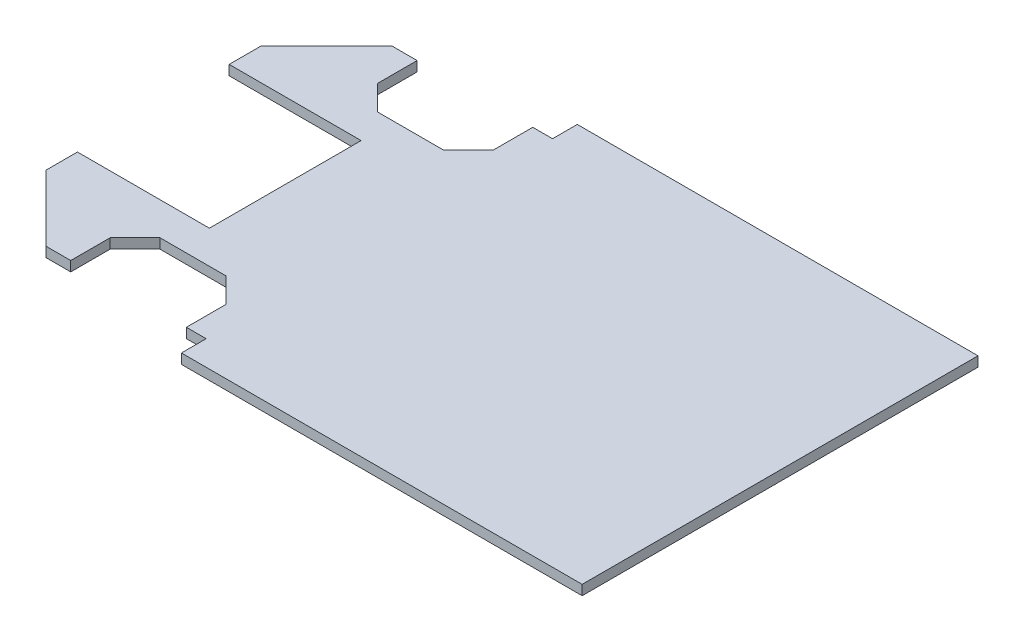
ISO-10303-21;
HEADER;
FILE_DESCRIPTION(('STEP AP214'),'2;1');
FILE_NAME('part.step','',(''),(''),'','','');
FILE_SCHEMA(('AUTOMOTIVE_DESIGN { 1 0 10303 214 1 1 1 1 }'));
ENDSEC;
DATA;
#1=APPLICATION_CONTEXT('core data for automotive mechanical design processes');
#2=APPLICATION_PROTOCOL_DEFINITION('international standard','automotive_design',2000,#1);
#3=PRODUCT_CONTEXT('',#1,'mechanical');
#4=PRODUCT('Part','Part','',(#3));
#5=PRODUCT_RELATED_PRODUCT_CATEGORY('part','',(#4));
#6=PRODUCT_DEFINITION_FORMATION('','',#4);
#7=PRODUCT_DEFINITION_CONTEXT('part definition',#1,'design');
#8=PRODUCT_DEFINITION('design','',#6,#7);
#9=PRODUCT_DEFINITION_SHAPE('','',#8);
#10=(LENGTH_UNIT() NAMED_UNIT(*) SI_UNIT(.MILLI.,.METRE.));
#11=(NAMED_UNIT(*) PLANE_ANGLE_UNIT() SI_UNIT($,.RADIAN.));
#12=(NAMED_UNIT(*) SI_UNIT($,.STERADIAN.) SOLID_ANGLE_UNIT());
#13=UNCERTAINTY_MEASURE_WITH_UNIT(LENGTH_MEASURE(1.E-05),#10,'distance_accuracy_value','');
#14=(GEOMETRIC_REPRESENTATION_CONTEXT(3) GLOBAL_UNCERTAINTY_ASSIGNED_CONTEXT((#13)) GLOBAL_UNIT_ASSIGNED_CONTEXT((#10,
#11,#12)) REPRESENTATION_CONTEXT('',''));
#15=CARTESIAN_POINT('',(0.,0.,0.));
#16=DIRECTION('',(0.,0.,1.));
#17=DIRECTION('',(1.,0.,0.));
#18=AXIS2_PLACEMENT_3D('',#15,#16,#17);
#19=CARTESIAN_POINT('',(-16.2633155669063,3.,-16.2633155669061));
#20=DIRECTION('',(-0.707106781186551,0.,-0.707106781186544));
#21=DIRECTION('',(-0.707106781186544,0.,0.707106781186551));
#22=AXIS2_PLACEMENT_3D('',#19,#20,#21);
#23=PLANE('',#22);
#24=DIRECTION('',(0.707106781186544,0.,-0.707106781186551));
#25=VECTOR('',#24,1.);
#26=CARTESIAN_POINT('',(-16.2633155669063,0.,-16.2633155669061));
#27=LINE('',#26,#25);
#28=CARTESIAN_POINT('',(0.,0.,-32.5266311338125));
#29=VERTEX_POINT('',#28);
#30=CARTESIAN_POINT('',(19.9733688661873,0.,-52.5));
#31=VERTEX_POINT('',#30);
#32=EDGE_CURVE('E238',#29,#31,#27,.T.);
#33=ORIENTED_EDGE('',*,*,#32,.F.);
#34=DIRECTION('',(0.,-1.,0.));
#35=VECTOR('',#34,1.);
#36=CARTESIAN_POINT('',(0.,3.,-32.5266311338125));
#37=LINE('',#36,#35);
#38=CARTESIAN_POINT('',(0.,3.,-32.5266311338125));
#39=VERTEX_POINT('',#38);
#40=EDGE_CURVE('E11',#39,#29,#37,.T.);
#41=ORIENTED_EDGE('',*,*,#40,.F.);
#42=DIRECTION('',(0.707106781186544,0.,-0.707106781186551));
#43=VECTOR('',#42,1.);
#44=CARTESIAN_POINT('',(-16.2633155669063,3.,-16.2633155669061));
#45=LINE('',#44,#43);
#46=CARTESIAN_POINT('',(19.9733688661873,3.,-52.5));
#47=VERTEX_POINT('',#46);
#48=EDGE_CURVE('E302',#39,#47,#45,.T.);
#49=ORIENTED_EDGE('',*,*,#48,.T.);
#50=DIRECTION('',(0.,-1.,0.));
#51=VECTOR('',#50,1.);
#52=CARTESIAN_POINT('',(19.9733688661873,3.,-52.5));
#53=LINE('',#52,#51);
#54=EDGE_CURVE('E53',#47,#31,#53,.T.);
#55=ORIENTED_EDGE('',*,*,#54,.T.);
#56=EDGE_LOOP('',(#33,#41,#49,#55));
#57=FACE_BOUND('',#56,.T.);
#58=ADVANCED_FACE('F37',(#57),#23,.T.);
#59=CARTESIAN_POINT('',(0.,3.,0.));
#60=DIRECTION('',(-1.,0.,0.));
#61=DIRECTION('',(0.,0.,1.));
#62=AXIS2_PLACEMENT_3D('',#59,#60,#61);
#63=PLANE('',#62);
#64=DIRECTION('',(0.,0.,-1.));
#65=VECTOR('',#64,1.);
#66=CARTESIAN_POINT('',(0.,0.,0.));
#67=LINE('',#66,#65);
#68=CARTESIAN_POINT('',(0.,0.,-23.));
#69=VERTEX_POINT('',#68);
#70=EDGE_CURVE('E240',#69,#29,#67,.T.);
#71=ORIENTED_EDGE('',*,*,#70,.F.);
#72=DIRECTION('',(0.,-1.,0.));
#73=VECTOR('',#72,1.);
#74=CARTESIAN_POINT('',(0.,3.,-23.));
#75=LINE('',#74,#73);
#76=CARTESIAN_POINT('',(0.,3.,-23.));
#77=VERTEX_POINT('',#76);
#78=EDGE_CURVE('E45',#77,#69,#75,.T.);
#79=ORIENTED_EDGE('',*,*,#78,.F.);
#80=DIRECTION('',(0.,0.,-1.));
#81=VECTOR('',#80,1.);
#82=CARTESIAN_POINT('',(0.,3.,0.));
#83=LINE('',#82,#81);
#84=EDGE_CURVE('E385',#77,#39,#83,.T.);
#85=ORIENTED_EDGE('',*,*,#84,.T.);
#86=ORIENTED_EDGE('',*,*,#40,.T.);
#87=EDGE_LOOP('',(#71,#79,#85,#86));
#88=FACE_BOUND('',#87,.T.);
#89=ADVANCED_FACE('F363',(#88),#63,.T.);
#90=CARTESIAN_POINT('',(0.,3.,-23.));
#91=DIRECTION('',(0.,0.,1.));
#92=DIRECTION('',(1.,0.,0.));
#93=AXIS2_PLACEMENT_3D('',#90,#91,#92);
#94=PLANE('',#93);
#95=DIRECTION('',(-1.,0.,0.));
#96=VECTOR('',#95,1.);
#97=CARTESIAN_POINT('',(0.,0.,-23.));
#98=LINE('',#97,#96);
#99=CARTESIAN_POINT('',(40.,0.,-23.));
#100=VERTEX_POINT('',#99);
#101=EDGE_CURVE('E243',#100,#69,#98,.T.);
#102=ORIENTED_EDGE('',*,*,#101,.F.);
#103=DIRECTION('',(0.,-1.,0.));
#104=VECTOR('',#103,1.);
#105=CARTESIAN_POINT('',(40.,3.,-23.));
#106=LINE('',#105,#104);
#107=CARTESIAN_POINT('',(40.,3.,-23.));
#108=VERTEX_POINT('',#107);
#109=EDGE_CURVE('E352',#108,#100,#106,.T.);
#110=ORIENTED_EDGE('',*,*,#109,.F.);
#111=DIRECTION('',(-1.,0.,0.));
#112=VECTOR('',#111,1.);
#113=CARTESIAN_POINT('',(0.,3.,-23.));
#114=LINE('',#113,#112);
#115=EDGE_CURVE('E359',#108,#77,#114,.T.);
#116=ORIENTED_EDGE('',*,*,#115,.T.);
#117=ORIENTED_EDGE('',*,*,#78,.T.);
#118=EDGE_LOOP('',(#102,#110,#116,#117));
#119=FACE_BOUND('',#118,.T.);
#120=ADVANCED_FACE('F357',(#119),#94,.T.);
#121=CARTESIAN_POINT('',(40.,3.,0.));
#122=DIRECTION('',(1.,0.,0.));
#123=DIRECTION('',(0.,0.,-1.));
#124=AXIS2_PLACEMENT_3D('',#121,#122,#123);
#125=PLANE('',#124);
#126=DIRECTION('',(0.,0.,1.));
#127=VECTOR('',#126,1.);
#128=CARTESIAN_POINT('',(40.,0.,0.));
#129=LINE('',#128,#127);
#130=CARTESIAN_POINT('',(40.,0.,23.));
#131=VERTEX_POINT('',#130);
#132=EDGE_CURVE('E247',#100,#131,#129,.T.);
#133=ORIENTED_EDGE('',*,*,#132,.T.);
#134=DIRECTION('',(0.,-1.,0.));
#135=VECTOR('',#134,1.);
#136=CARTESIAN_POINT('',(40.,3.,23.));
#137=LINE('',#136,#135);
#138=CARTESIAN_POINT('',(40.,3.,23.));
#139=VERTEX_POINT('',#138);
#140=EDGE_CURVE('E349',#139,#131,#137,.T.);
#141=ORIENTED_EDGE('',*,*,#140,.F.);
#142=DIRECTION('',(0.,0.,1.));
#143=VECTOR('',#142,1.);
#144=CARTESIAN_POINT('',(40.,3.,0.));
#145=LINE('',#144,#143);
#146=EDGE_CURVE('E381',#108,#139,#145,.T.);
#147=ORIENTED_EDGE('',*,*,#146,.F.);
#148=ORIENTED_EDGE('',*,*,#109,.T.);
#149=EDGE_LOOP('',(#133,#141,#147,#148));
#150=FACE_BOUND('',#149,.T.);
#151=ADVANCED_FACE('F371',(#150),#125,.F.);
#152=CARTESIAN_POINT('',(0.,3.,23.));
#153=DIRECTION('',(0.,0.,1.));
#154=DIRECTION('',(1.,0.,0.));
#155=AXIS2_PLACEMENT_3D('',#152,#153,#154);
#156=PLANE('',#155);
#157=DIRECTION('',(-1.,0.,0.));
#158=VECTOR('',#157,1.);
#159=CARTESIAN_POINT('',(0.,0.,23.));
#160=LINE('',#159,#158);
#161=CARTESIAN_POINT('',(0.,0.,23.));
#162=VERTEX_POINT('',#161);
#163=EDGE_CURVE('E249',#131,#162,#160,.T.);
#164=ORIENTED_EDGE('',*,*,#163,.T.);
#165=DIRECTION('',(0.,-1.,0.));
#166=VECTOR('',#165,1.);
#167=CARTESIAN_POINT('',(0.,3.,23.));
#168=LINE('',#167,#166);
#169=CARTESIAN_POINT('',(0.,3.,23.));
#170=VERTEX_POINT('',#169);
#171=EDGE_CURVE('E347',#170,#162,#168,.T.);
#172=ORIENTED_EDGE('',*,*,#171,.F.);
#173=DIRECTION('',(-1.,0.,0.));
#174=VECTOR('',#173,1.);
#175=CARTESIAN_POINT('',(0.,3.,23.));
#176=LINE('',#175,#174);
#177=EDGE_CURVE('E377',#139,#170,#176,.T.);
#178=ORIENTED_EDGE('',*,*,#177,.F.);
#179=ORIENTED_EDGE('',*,*,#140,.T.);
#180=EDGE_LOOP('',(#164,#172,#178,#179));
#181=FACE_BOUND('',#180,.T.);
#182=ADVANCED_FACE('F375',(#181),#156,.F.);
#183=CARTESIAN_POINT('',(0.,0.,32.5266311338125));
#184=VERTEX_POINT('',#183);
#185=EDGE_CURVE('E244',#184,#162,#67,.T.);
#186=ORIENTED_EDGE('',*,*,#185,.F.);
#187=DIRECTION('',(0.,-1.,0.));
#188=VECTOR('',#187,1.);
#189=CARTESIAN_POINT('',(0.,3.,32.5266311338125));
#190=LINE('',#189,#188);
#191=CARTESIAN_POINT('',(0.,3.,32.5266311338125));
#192=VERTEX_POINT('',#191);
#193=EDGE_CURVE('E345',#192,#184,#190,.T.);
#194=ORIENTED_EDGE('',*,*,#193,.F.);
#195=EDGE_CURVE('E380',#192,#170,#83,.T.);
#196=ORIENTED_EDGE('',*,*,#195,.T.);
#197=ORIENTED_EDGE('',*,*,#171,.T.);
#198=EDGE_LOOP('',(#186,#194,#196,#197));
#199=FACE_BOUND('',#198,.T.);
#200=ADVANCED_FACE('F445',(#199),#63,.T.);
#201=CARTESIAN_POINT('',(-16.2633155669063,3.,16.2633155669061));
#202=DIRECTION('',(0.707106781186551,0.,-0.707106781186544));
#203=DIRECTION('',(-0.707106781186544,0.,-0.707106781186551));
#204=AXIS2_PLACEMENT_3D('',#201,#202,#203);
#205=PLANE('',#204);
#206=DIRECTION('',(0.707106781186544,0.,0.707106781186551));
#207=VECTOR('',#206,1.);
#208=CARTESIAN_POINT('',(-16.2633155669063,0.,16.2633155669061));
#209=LINE('',#208,#207);
#210=CARTESIAN_POINT('',(19.9733688661873,0.,52.5));
#211=VERTEX_POINT('',#210);
#212=EDGE_CURVE('E252',#184,#211,#209,.T.);
#213=ORIENTED_EDGE('',*,*,#212,.T.);
#214=DIRECTION('',(0.,-1.,0.));
#215=VECTOR('',#214,1.);
#216=CARTESIAN_POINT('',(19.9733688661873,3.,52.5));
#217=LINE('',#216,#215);
#218=CARTESIAN_POINT('',(19.9733688661873,3.,52.5));
#219=VERTEX_POINT('',#218);
#220=EDGE_CURVE('E342',#219,#211,#217,.T.);
#221=ORIENTED_EDGE('',*,*,#220,.F.);
#222=DIRECTION('',(0.707106781186544,0.,0.707106781186551));
#223=VECTOR('',#222,1.);
#224=CARTESIAN_POINT('',(-16.2633155669063,3.,16.2633155669061));
#225=LINE('',#224,#223);
#226=EDGE_CURVE('E383',#192,#219,#225,.T.);
#227=ORIENTED_EDGE('',*,*,#226,.F.);
#228=ORIENTED_EDGE('',*,*,#193,.T.);
#229=EDGE_LOOP('',(#213,#221,#227,#228));
#230=FACE_BOUND('',#229,.T.);
#231=ADVANCED_FACE('F452',(#230),#205,.F.);
#232=CARTESIAN_POINT('',(0.,3.,52.5));
#233=DIRECTION('',(0.,0.,-1.));
#234=DIRECTION('',(-1.,0.,0.));
#235=AXIS2_PLACEMENT_3D('',#232,#233,#234);
#236=PLANE('',#235);
#237=DIRECTION('',(1.,0.,0.));
#238=VECTOR('',#237,1.);
#239=CARTESIAN_POINT('',(0.,0.,52.5));
#240=LINE('',#239,#238);
#241=CARTESIAN_POINT('',(27.4733688661873,0.,52.5));
#242=VERTEX_POINT('',#241);
#243=EDGE_CURVE('E254',#211,#242,#240,.T.);
#244=ORIENTED_EDGE('',*,*,#243,.T.);
#245=DIRECTION('',(0.,-1.,0.));
#246=VECTOR('',#245,1.);
#247=CARTESIAN_POINT('',(27.4733688661873,3.,52.5));
#248=LINE('',#247,#246);
#249=CARTESIAN_POINT('',(27.4733688661873,3.,52.5));
#250=VERTEX_POINT('',#249);
#251=EDGE_CURVE('E340',#250,#242,#248,.T.);
#252=ORIENTED_EDGE('',*,*,#251,.F.);
#253=DIRECTION('',(1.,0.,0.));
#254=VECTOR('',#253,1.);
#255=CARTESIAN_POINT('',(0.,3.,52.5));
#256=LINE('',#255,#254);
#257=EDGE_CURVE('E390',#219,#250,#256,.T.);
#258=ORIENTED_EDGE('',*,*,#257,.F.);
#259=ORIENTED_EDGE('',*,*,#220,.T.);
#260=EDGE_LOOP('',(#244,#252,#258,#259));
#261=FACE_BOUND('',#260,.T.);
#262=ADVANCED_FACE('F458',(#261),#236,.F.);
#263=CARTESIAN_POINT('',(27.4733688661873,3.,0.));
#264=DIRECTION('',(1.,0.,0.));
#265=DIRECTION('',(0.,0.,-1.));
#266=AXIS2_PLACEMENT_3D('',#263,#264,#265);
#267=PLANE('',#266);
#268=DIRECTION('',(0.,0.,1.));
#269=VECTOR('',#268,1.);
#270=CARTESIAN_POINT('',(27.4733688661873,0.,0.));
#271=LINE('',#270,#269);
#272=CARTESIAN_POINT('',(27.4733688661873,0.,40.5266311338127));
#273=VERTEX_POINT('',#272);
#274=EDGE_CURVE('E257',#273,#242,#271,.T.);
#275=ORIENTED_EDGE('',*,*,#274,.F.);
#276=DIRECTION('',(0.,-1.,0.));
#277=VECTOR('',#276,1.);
#278=CARTESIAN_POINT('',(27.4733688661873,3.,40.5266311338127));
#279=LINE('',#278,#277);
#280=CARTESIAN_POINT('',(27.4733688661873,3.,40.5266311338127));
#281=VERTEX_POINT('',#280);
#282=EDGE_CURVE('E338',#281,#273,#279,.T.);
#283=ORIENTED_EDGE('',*,*,#282,.F.);
#284=DIRECTION('',(0.,0.,1.));
#285=VECTOR('',#284,1.);
#286=CARTESIAN_POINT('',(27.4733688661873,3.,0.));
#287=LINE('',#286,#285);
#288=EDGE_CURVE('E392',#281,#250,#287,.T.);
#289=ORIENTED_EDGE('',*,*,#288,.T.);
#290=ORIENTED_EDGE('',*,*,#251,.T.);
#291=EDGE_LOOP('',(#275,#283,#289,#290));
#292=FACE_BOUND('',#291,.T.);
#293=ADVANCED_FACE('F552',(#292),#267,.T.);
#294=CARTESIAN_POINT('',(34.0000000000001,3.,33.9999999999999));
#295=DIRECTION('',(0.707106781186549,0.,0.707106781186546));
#296=DIRECTION('',(0.707106781186546,0.,-0.707106781186549));
#297=AXIS2_PLACEMENT_3D('',#294,#295,#296);
#298=PLANE('',#297);
#299=DIRECTION('',(-0.707106781186546,0.,0.707106781186549));
#300=VECTOR('',#299,1.);
#301=CARTESIAN_POINT('',(34.0000000000001,0.,33.9999999999999));
#302=LINE('',#301,#300);
#303=CARTESIAN_POINT('',(35.,0.,33.));
#304=VERTEX_POINT('',#303);
#305=EDGE_CURVE('E260',#304,#273,#302,.T.);
#306=ORIENTED_EDGE('',*,*,#305,.F.);
#307=DIRECTION('',(0.,-1.,0.));
#308=VECTOR('',#307,1.);
#309=CARTESIAN_POINT('',(35.,3.,33.));
#310=LINE('',#309,#308);
#311=CARTESIAN_POINT('',(35.,3.,33.));
#312=VERTEX_POINT('',#311);
#313=EDGE_CURVE('E336',#312,#304,#310,.T.);
#314=ORIENTED_EDGE('',*,*,#313,.F.);
#315=DIRECTION('',(-0.707106781186546,0.,0.707106781186549));
#316=VECTOR('',#315,1.);
#317=CARTESIAN_POINT('',(34.0000000000001,3.,33.9999999999999));
#318=LINE('',#317,#316);
#319=EDGE_CURVE('E395',#312,#281,#318,.T.);
#320=ORIENTED_EDGE('',*,*,#319,.T.);
#321=ORIENTED_EDGE('',*,*,#282,.T.);
#322=EDGE_LOOP('',(#306,#314,#320,#321));
#323=FACE_BOUND('',#322,.T.);
#324=ADVANCED_FACE('F473',(#323),#298,.T.);
#325=CARTESIAN_POINT('',(0.,3.,33.));
#326=DIRECTION('',(0.,0.,-1.));
#327=DIRECTION('',(-1.,0.,0.));
#328=AXIS2_PLACEMENT_3D('',#325,#326,#327);
#329=PLANE('',#328);
#330=DIRECTION('',(1.,0.,0.));
#331=VECTOR('',#330,1.);
#332=CARTESIAN_POINT('',(0.,0.,33.));
#333=LINE('',#332,#331);
#334=CARTESIAN_POINT('',(55.,0.,33.));
#335=VERTEX_POINT('',#334);
#336=EDGE_CURVE('E263',#304,#335,#333,.T.);
#337=ORIENTED_EDGE('',*,*,#336,.T.);
#338=DIRECTION('',(0.,-1.,0.));
#339=VECTOR('',#338,1.);
#340=CARTESIAN_POINT('',(55.,3.,33.));
#341=LINE('',#340,#339);
#342=CARTESIAN_POINT('',(55.,3.,33.));
#343=VERTEX_POINT('',#342);
#344=EDGE_CURVE('E333',#343,#335,#341,.T.);
#345=ORIENTED_EDGE('',*,*,#344,.F.);
#346=DIRECTION('',(1.,0.,0.));
#347=VECTOR('',#346,1.);
#348=CARTESIAN_POINT('',(0.,3.,33.));
#349=LINE('',#348,#347);
#350=EDGE_CURVE('E398',#312,#343,#349,.T.);
#351=ORIENTED_EDGE('',*,*,#350,.F.);
#352=ORIENTED_EDGE('',*,*,#313,.T.);
#353=EDGE_LOOP('',(#337,#345,#351,#352));
#354=FACE_BOUND('',#353,.T.);
#355=ADVANCED_FACE('F479',(#354),#329,.F.);
#356=CARTESIAN_POINT('',(10.9999999999998,3.,-10.9999999999999));
#357=DIRECTION('',(0.707106781186545,0.,-0.70710678118655));
#358=DIRECTION('',(-0.70710678118655,0.,-0.707106781186545));
#359=AXIS2_PLACEMENT_3D('',#356,#357,#358);
#360=PLANE('',#359);
#361=DIRECTION('',(0.70710678118655,0.,0.707106781186545));
#362=VECTOR('',#361,1.);
#363=CARTESIAN_POINT('',(10.9999999999998,0.,-10.9999999999999));
#364=LINE('',#363,#362);
#365=CARTESIAN_POINT('',(62.5266311338128,0.,40.5266311338128));
#366=VERTEX_POINT('',#365);
#367=EDGE_CURVE('E265',#335,#366,#364,.T.);
#368=ORIENTED_EDGE('',*,*,#367,.T.);
#369=DIRECTION('',(0.,-1.,0.));
#370=VECTOR('',#369,1.);
#371=CARTESIAN_POINT('',(62.5266311338128,3.,40.5266311338128));
#372=LINE('',#371,#370);
#373=CARTESIAN_POINT('',(62.5266311338128,3.,40.5266311338128));
#374=VERTEX_POINT('',#373);
#375=EDGE_CURVE('E330',#374,#366,#372,.T.);
#376=ORIENTED_EDGE('',*,*,#375,.F.);
#377=DIRECTION('',(0.70710678118655,0.,0.707106781186545));
#378=VECTOR('',#377,1.);
#379=CARTESIAN_POINT('',(10.9999999999998,3.,-10.9999999999999));
#380=LINE('',#379,#378);
#381=EDGE_CURVE('E400',#343,#374,#380,.T.);
#382=ORIENTED_EDGE('',*,*,#381,.F.);
#383=ORIENTED_EDGE('',*,*,#344,.T.);
#384=EDGE_LOOP('',(#368,#376,#382,#383));
#385=FACE_BOUND('',#384,.T.);
#386=ADVANCED_FACE('F485',(#385),#360,.F.);
#387=CARTESIAN_POINT('',(62.5266311338129,3.,1.4494355413421E-13));
#388=DIRECTION('',(1.,0.,0.));
#389=DIRECTION('',(0.,0.,-1.));
#390=AXIS2_PLACEMENT_3D('',#387,#388,#389);
#391=PLANE('',#390);
#392=DIRECTION('',(0.,0.,1.));
#393=VECTOR('',#392,1.);
#394=CARTESIAN_POINT('',(62.5266311338129,0.,1.4494355413421E-13));
#395=LINE('',#394,#393);
#396=CARTESIAN_POINT('',(62.5266311338128,0.,52.5));
#397=VERTEX_POINT('',#396);
#398=EDGE_CURVE('E267',#366,#397,#395,.T.);
#399=ORIENTED_EDGE('',*,*,#398,.T.);
#400=DIRECTION('',(0.,-1.,0.));
#401=VECTOR('',#400,1.);
#402=CARTESIAN_POINT('',(62.5266311338128,3.,52.5));
#403=LINE('',#402,#401);
#404=CARTESIAN_POINT('',(62.5266311338128,3.,52.5));
#405=VERTEX_POINT('',#404);
#406=EDGE_CURVE('E327',#405,#397,#403,.T.);
#407=ORIENTED_EDGE('',*,*,#406,.F.);
#408=DIRECTION('',(0.,0.,1.));
#409=VECTOR('',#408,1.);
#410=CARTESIAN_POINT('',(62.5266311338129,3.,1.4494355413421E-13));
#411=LINE('',#410,#409);
#412=EDGE_CURVE('E402',#374,#405,#411,.T.);
#413=ORIENTED_EDGE('',*,*,#412,.F.);
#414=ORIENTED_EDGE('',*,*,#375,.T.);
#415=EDGE_LOOP('',(#399,#407,#413,#414));
#416=FACE_BOUND('',#415,.T.);
#417=ADVANCED_FACE('F489',(#416),#391,.F.);
#418=CARTESIAN_POINT('',(0.,3.,52.5));
#419=DIRECTION('',(0.,0.,-1.));
#420=DIRECTION('',(-1.,0.,0.));
#421=AXIS2_PLACEMENT_3D('',#418,#419,#420);
#422=PLANE('',#421);
#423=DIRECTION('',(1.,0.,0.));
#424=VECTOR('',#423,1.);
#425=CARTESIAN_POINT('',(0.,0.,52.5));
#426=LINE('',#425,#424);
#427=CARTESIAN_POINT('',(68.5266311338128,0.,52.5));
#428=VERTEX_POINT('',#427);
#429=EDGE_CURVE('E269',#397,#428,#426,.T.);
#430=ORIENTED_EDGE('',*,*,#429,.T.);
#431=DIRECTION('',(0.,-1.,0.));
#432=VECTOR('',#431,1.);
#433=CARTESIAN_POINT('',(68.5266311338128,3.,52.5));
#434=LINE('',#433,#432);
#435=CARTESIAN_POINT('',(68.5266311338128,3.,52.5));
#436=VERTEX_POINT('',#435);
#437=EDGE_CURVE('E324',#436,#428,#434,.T.);
#438=ORIENTED_EDGE('',*,*,#437,.F.);
#439=DIRECTION('',(1.,0.,0.));
#440=VECTOR('',#439,1.);
#441=CARTESIAN_POINT('',(0.,3.,52.5));
#442=LINE('',#441,#440);
#443=EDGE_CURVE('E404',#405,#436,#442,.T.);
#444=ORIENTED_EDGE('',*,*,#443,.F.);
#445=ORIENTED_EDGE('',*,*,#406,.T.);
#446=EDGE_LOOP('',(#430,#438,#444,#445));
#447=FACE_BOUND('',#446,.T.);
#448=ADVANCED_FACE('F494',(#447),#422,.F.);
#449=CARTESIAN_POINT('',(68.5266311338128,3.,0.));
#450=DIRECTION('',(1.,0.,0.));
#451=DIRECTION('',(0.,0.,-1.));
#452=AXIS2_PLACEMENT_3D('',#449,#450,#451);
#453=PLANE('',#452);
#454=DIRECTION('',(0.,0.,1.));
#455=VECTOR('',#454,1.);
#456=CARTESIAN_POINT('',(68.5266311338128,0.,0.));
#457=LINE('',#456,#455);
#458=CARTESIAN_POINT('',(68.5266311338128,0.,60.));
#459=VERTEX_POINT('',#458);
#460=EDGE_CURVE('E271',#428,#459,#457,.T.);
#461=ORIENTED_EDGE('',*,*,#460,.T.);
#462=DIRECTION('',(0.,-1.,0.));
#463=VECTOR('',#462,1.);
#464=CARTESIAN_POINT('',(68.5266311338128,3.,60.));
#465=LINE('',#464,#463);
#466=CARTESIAN_POINT('',(68.5266311338128,3.,60.));
#467=VERTEX_POINT('',#466);
#468=EDGE_CURVE('E321',#467,#459,#465,.T.);
#469=ORIENTED_EDGE('',*,*,#468,.F.);
#470=DIRECTION('',(0.,0.,1.));
#471=VECTOR('',#470,1.);
#472=CARTESIAN_POINT('',(68.5266311338128,3.,0.));
#473=LINE('',#472,#471);
#474=EDGE_CURVE('E406',#436,#467,#473,.T.);
#475=ORIENTED_EDGE('',*,*,#474,.F.);
#476=ORIENTED_EDGE('',*,*,#437,.T.);
#477=EDGE_LOOP('',(#461,#469,#475,#476));
#478=FACE_BOUND('',#477,.T.);
#479=ADVANCED_FACE('F500',(#478),#453,.F.);
#480=CARTESIAN_POINT('',(0.,3.,60.));
#481=DIRECTION('',(0.,0.,-1.));
#482=DIRECTION('',(-1.,0.,0.));
#483=AXIS2_PLACEMENT_3D('',#480,#481,#482);
#484=PLANE('',#483);
#485=DIRECTION('',(1.,0.,0.));
#486=VECTOR('',#485,1.);
#487=CARTESIAN_POINT('',(0.,0.,60.));
#488=LINE('',#487,#486);
#489=CARTESIAN_POINT('',(190.,0.,60.));
#490=VERTEX_POINT('',#489);
#491=EDGE_CURVE('E273',#459,#490,#488,.T.);
#492=ORIENTED_EDGE('',*,*,#491,.T.);
#493=DIRECTION('',(0.,-1.,0.));
#494=VECTOR('',#493,1.);
#495=CARTESIAN_POINT('',(190.,3.,60.));
#496=LINE('',#495,#494);
#497=CARTESIAN_POINT('',(190.,3.,60.));
#498=VERTEX_POINT('',#497);
#499=EDGE_CURVE('E318',#498,#490,#496,.T.);
#500=ORIENTED_EDGE('',*,*,#499,.F.);
#501=DIRECTION('',(1.,0.,0.));
#502=VECTOR('',#501,1.);
#503=CARTESIAN_POINT('',(0.,3.,60.));
#504=LINE('',#503,#502);
#505=EDGE_CURVE('E408',#467,#498,#504,.T.);
#506=ORIENTED_EDGE('',*,*,#505,.F.);
#507=ORIENTED_EDGE('',*,*,#468,.T.);
#508=EDGE_LOOP('',(#492,#500,#506,#507));
#509=FACE_BOUND('',#508,.T.);
#510=ADVANCED_FACE('F504',(#509),#484,.F.);
#511=CARTESIAN_POINT('',(190.,3.,0.));
#512=DIRECTION('',(-1.,0.,0.));
#513=DIRECTION('',(0.,0.,1.));
#514=AXIS2_PLACEMENT_3D('',#511,#512,#513);
#515=PLANE('',#514);
#516=DIRECTION('',(0.,0.,-1.));
#517=VECTOR('',#516,1.);
#518=CARTESIAN_POINT('',(190.,0.,0.));
#519=LINE('',#518,#517);
#520=CARTESIAN_POINT('',(190.,0.,-60.));
#521=VERTEX_POINT('',#520);
#522=EDGE_CURVE('E275',#490,#521,#519,.T.);
#523=ORIENTED_EDGE('',*,*,#522,.T.);
#524=DIRECTION('',(0.,-1.,0.));
#525=VECTOR('',#524,1.);
#526=CARTESIAN_POINT('',(190.,3.,-60.));
#527=LINE('',#526,#525);
#528=CARTESIAN_POINT('',(190.,3.,-60.));
#529=VERTEX_POINT('',#528);
#530=EDGE_CURVE('E316',#529,#521,#527,.T.);
#531=ORIENTED_EDGE('',*,*,#530,.F.);
#532=DIRECTION('',(0.,0.,-1.));
#533=VECTOR('',#532,1.);
#534=CARTESIAN_POINT('',(190.,3.,0.));
#535=LINE('',#534,#533);
#536=EDGE_CURVE('E410',#498,#529,#535,.T.);
#537=ORIENTED_EDGE('',*,*,#536,.F.);
#538=ORIENTED_EDGE('',*,*,#499,.T.);
#539=EDGE_LOOP('',(#523,#531,#537,#538));
#540=FACE_BOUND('',#539,.T.);
#541=ADVANCED_FACE('F509',(#540),#515,.F.);
#542=CARTESIAN_POINT('',(0.,3.,-60.));
#543=DIRECTION('',(0.,0.,-1.));
#544=DIRECTION('',(-1.,0.,0.));
#545=AXIS2_PLACEMENT_3D('',#542,#543,#544);
#546=PLANE('',#545);
#547=DIRECTION('',(1.,0.,0.));
#548=VECTOR('',#547,1.);
#549=CARTESIAN_POINT('',(0.,0.,-60.));
#550=LINE('',#549,#548);
#551=CARTESIAN_POINT('',(68.5266311338128,0.,-60.));
#552=VERTEX_POINT('',#551);
#553=EDGE_CURVE('E278',#552,#521,#550,.T.);
#554=ORIENTED_EDGE('',*,*,#553,.F.);
#555=DIRECTION('',(0.,-1.,0.));
#556=VECTOR('',#555,1.);
#557=CARTESIAN_POINT('',(68.5266311338128,3.,-60.));
#558=LINE('',#557,#556);
#559=CARTESIAN_POINT('',(68.5266311338128,3.,-60.));
#560=VERTEX_POINT('',#559);
#561=EDGE_CURVE('E314',#560,#552,#558,.T.);
#562=ORIENTED_EDGE('',*,*,#561,.F.);
#563=DIRECTION('',(1.,0.,0.));
#564=VECTOR('',#563,1.);
#565=CARTESIAN_POINT('',(0.,3.,-60.));
#566=LINE('',#565,#564);
#567=EDGE_CURVE('E412',#560,#529,#566,.T.);
#568=ORIENTED_EDGE('',*,*,#567,.T.);
#569=ORIENTED_EDGE('',*,*,#530,.T.);
#570=EDGE_LOOP('',(#554,#562,#568,#569));
#571=FACE_BOUND('',#570,.T.);
#572=ADVANCED_FACE('F527',(#571),#546,.T.);
#573=CARTESIAN_POINT('',(68.5266311338128,3.,0.));
#574=DIRECTION('',(-1.,0.,0.));
#575=DIRECTION('',(0.,0.,1.));
#576=AXIS2_PLACEMENT_3D('',#573,#574,#575);
#577=PLANE('',#576);
#578=DIRECTION('',(0.,0.,-1.));
#579=VECTOR('',#578,1.);
#580=CARTESIAN_POINT('',(68.5266311338128,0.,0.));
#581=LINE('',#580,#579);
#582=CARTESIAN_POINT('',(68.5266311338128,0.,-52.5));
#583=VERTEX_POINT('',#582);
#584=EDGE_CURVE('E281',#583,#552,#581,.T.);
#585=ORIENTED_EDGE('',*,*,#584,.F.);
#586=DIRECTION('',(0.,-1.,0.));
#587=VECTOR('',#586,1.);
#588=CARTESIAN_POINT('',(68.5266311338128,3.,-52.5));
#589=LINE('',#588,#587);
#590=CARTESIAN_POINT('',(68.5266311338128,3.,-52.5));
#591=VERTEX_POINT('',#590);
#592=EDGE_CURVE('E312',#591,#583,#589,.T.);
#593=ORIENTED_EDGE('',*,*,#592,.F.);
#594=DIRECTION('',(0.,0.,-1.));
#595=VECTOR('',#594,1.);
#596=CARTESIAN_POINT('',(68.5266311338128,3.,0.));
#597=LINE('',#596,#595);
#598=EDGE_CURVE('E415',#591,#560,#597,.T.);
#599=ORIENTED_EDGE('',*,*,#598,.T.);
#600=ORIENTED_EDGE('',*,*,#561,.T.);
#601=EDGE_LOOP('',(#585,#593,#599,#600));
#602=FACE_BOUND('',#601,.T.);
#603=ADVANCED_FACE('F516',(#602),#577,.T.);
#604=CARTESIAN_POINT('',(0.,3.,-52.5));
#605=DIRECTION('',(0.,0.,-1.));
#606=DIRECTION('',(-1.,0.,0.));
#607=AXIS2_PLACEMENT_3D('',#604,#605,#606);
#608=PLANE('',#607);
#609=DIRECTION('',(1.,0.,0.));
#610=VECTOR('',#609,1.);
#611=CARTESIAN_POINT('',(0.,0.,-52.5));
#612=LINE('',#611,#610);
#613=CARTESIAN_POINT('',(62.5266311338127,0.,-52.5));
#614=VERTEX_POINT('',#613);
#615=EDGE_CURVE('E284',#614,#583,#612,.T.);
#616=ORIENTED_EDGE('',*,*,#615,.F.);
#617=DIRECTION('',(0.,-1.,0.));
#618=VECTOR('',#617,1.);
#619=CARTESIAN_POINT('',(62.5266311338127,3.,-52.5));
#620=LINE('',#619,#618);
#621=CARTESIAN_POINT('',(62.5266311338127,3.,-52.5));
#622=VERTEX_POINT('',#621);
#623=EDGE_CURVE('E310',#622,#614,#620,.T.);
#624=ORIENTED_EDGE('',*,*,#623,.F.);
#625=DIRECTION('',(1.,0.,0.));
#626=VECTOR('',#625,1.);
#627=CARTESIAN_POINT('',(0.,3.,-52.5));
#628=LINE('',#627,#626);
#629=EDGE_CURVE('E418',#622,#591,#628,.T.);
#630=ORIENTED_EDGE('',*,*,#629,.T.);
#631=ORIENTED_EDGE('',*,*,#592,.T.);
#632=EDGE_LOOP('',(#616,#624,#630,#631));
#633=FACE_BOUND('',#632,.T.);
#634=ADVANCED_FACE('F520',(#633),#608,.T.);
#635=CARTESIAN_POINT('',(62.5266311338128,3.,0.));
#636=DIRECTION('',(-1.,0.,0.));
#637=DIRECTION('',(0.,0.,1.));
#638=AXIS2_PLACEMENT_3D('',#635,#636,#637);
#639=PLANE('',#638);
#640=DIRECTION('',(0.,0.,-1.));
#641=VECTOR('',#640,1.);
#642=CARTESIAN_POINT('',(62.5266311338128,0.,0.));
#643=LINE('',#642,#641);
#644=CARTESIAN_POINT('',(62.5266311338128,0.,-40.5266311338127));
#645=VERTEX_POINT('',#644);
#646=EDGE_CURVE('E287',#645,#614,#643,.T.);
#647=ORIENTED_EDGE('',*,*,#646,.F.);
#648=DIRECTION('',(0.,-1.,0.));
#649=VECTOR('',#648,1.);
#650=CARTESIAN_POINT('',(62.5266311338128,3.,-40.5266311338127));
#651=LINE('',#650,#649);
#652=CARTESIAN_POINT('',(62.5266311338128,3.,-40.5266311338127));
#653=VERTEX_POINT('',#652);
#654=EDGE_CURVE('E308',#653,#645,#651,.T.);
#655=ORIENTED_EDGE('',*,*,#654,.F.);
#656=DIRECTION('',(0.,0.,-1.));
#657=VECTOR('',#656,1.);
#658=CARTESIAN_POINT('',(62.5266311338128,3.,0.));
#659=LINE('',#658,#657);
#660=EDGE_CURVE('E421',#653,#622,#659,.T.);
#661=ORIENTED_EDGE('',*,*,#660,.T.);
#662=ORIENTED_EDGE('',*,*,#623,.T.);
#663=EDGE_LOOP('',(#647,#655,#661,#662));
#664=FACE_BOUND('',#663,.T.);
#665=ADVANCED_FACE('F524',(#664),#639,.T.);
#666=CARTESIAN_POINT('',(10.9999999999997,3.,10.9999999999998));
#667=DIRECTION('',(-0.707106781186544,0.,-0.707106781186551));
#668=DIRECTION('',(-0.707106781186551,0.,0.707106781186544));
#669=AXIS2_PLACEMENT_3D('',#666,#667,#668);
#670=PLANE('',#669);
#671=DIRECTION('',(0.707106781186551,0.,-0.707106781186544));
#672=VECTOR('',#671,1.);
#673=CARTESIAN_POINT('',(10.9999999999997,0.,10.9999999999998));
#674=LINE('',#673,#672);
#675=CARTESIAN_POINT('',(55.,0.,-33.));
#676=VERTEX_POINT('',#675);
#677=EDGE_CURVE('E290',#676,#645,#674,.T.);
#678=ORIENTED_EDGE('',*,*,#677,.F.);
#679=DIRECTION('',(0.,-1.,0.));
#680=VECTOR('',#679,1.);
#681=CARTESIAN_POINT('',(55.,3.,-33.));
#682=LINE('',#681,#680);
#683=CARTESIAN_POINT('',(55.,3.,-33.));
#684=VERTEX_POINT('',#683);
#685=EDGE_CURVE('E306',#684,#676,#682,.T.);
#686=ORIENTED_EDGE('',*,*,#685,.F.);
#687=DIRECTION('',(0.707106781186551,0.,-0.707106781186544));
#688=VECTOR('',#687,1.);
#689=CARTESIAN_POINT('',(10.9999999999997,3.,10.9999999999998));
#690=LINE('',#689,#688);
#691=EDGE_CURVE('E424',#684,#653,#690,.T.);
#692=ORIENTED_EDGE('',*,*,#691,.T.);
#693=ORIENTED_EDGE('',*,*,#654,.T.);
#694=EDGE_LOOP('',(#678,#686,#692,#693));
#695=FACE_BOUND('',#694,.T.);
#696=ADVANCED_FACE('F526',(#695),#670,.T.);
#697=CARTESIAN_POINT('',(0.,3.,-33.));
#698=DIRECTION('',(0.,0.,-1.));
#699=DIRECTION('',(-1.,0.,0.));
#700=AXIS2_PLACEMENT_3D('',#697,#698,#699);
#701=PLANE('',#700);
#702=DIRECTION('',(1.,0.,0.));
#703=VECTOR('',#702,1.);
#704=CARTESIAN_POINT('',(0.,0.,-33.));
#705=LINE('',#704,#703);
#706=CARTESIAN_POINT('',(35.,0.,-33.));
#707=VERTEX_POINT('',#706);
#708=EDGE_CURVE('E293',#707,#676,#705,.T.);
#709=ORIENTED_EDGE('',*,*,#708,.F.);
#710=DIRECTION('',(0.,-1.,0.));
#711=VECTOR('',#710,1.);
#712=CARTESIAN_POINT('',(35.,3.,-33.));
#713=LINE('',#712,#711);
#714=CARTESIAN_POINT('',(35.,3.,-33.));
#715=VERTEX_POINT('',#714);
#716=EDGE_CURVE('E230',#715,#707,#713,.T.);
#717=ORIENTED_EDGE('',*,*,#716,.F.);
#718=DIRECTION('',(1.,0.,0.));
#719=VECTOR('',#718,1.);
#720=CARTESIAN_POINT('',(0.,3.,-33.));
#721=LINE('',#720,#719);
#722=EDGE_CURVE('E220',#715,#684,#721,.T.);
#723=ORIENTED_EDGE('',*,*,#722,.T.);
#724=ORIENTED_EDGE('',*,*,#685,.T.);
#725=EDGE_LOOP('',(#709,#717,#723,#724));
#726=FACE_BOUND('',#725,.T.);
#727=ADVANCED_FACE('F428',(#726),#701,.T.);
#728=CARTESIAN_POINT('',(34.0000000000001,3.,-33.9999999999999));
#729=DIRECTION('',(-0.707106781186549,0.,0.707106781186546));
#730=DIRECTION('',(0.707106781186546,0.,0.707106781186549));
#731=AXIS2_PLACEMENT_3D('',#728,#729,#730);
#732=PLANE('',#731);
#733=DIRECTION('',(-0.707106781186546,0.,-0.707106781186549));
#734=VECTOR('',#733,1.);
#735=CARTESIAN_POINT('',(34.0000000000001,0.,-33.9999999999999));
#736=LINE('',#735,#734);
#737=CARTESIAN_POINT('',(27.4733688661873,0.,-40.5266311338128));
#738=VERTEX_POINT('',#737);
#739=EDGE_CURVE('E227',#707,#738,#736,.T.);
#740=ORIENTED_EDGE('',*,*,#739,.T.);
#741=DIRECTION('',(0.,-1.,0.));
#742=VECTOR('',#741,1.);
#743=CARTESIAN_POINT('',(27.4733688661873,3.,-40.5266311338128));
#744=LINE('',#743,#742);
#745=CARTESIAN_POINT('',(27.4733688661873,3.,-40.5266311338128));
#746=VERTEX_POINT('',#745);
#747=EDGE_CURVE('E224',#746,#738,#744,.T.);
#748=ORIENTED_EDGE('',*,*,#747,.F.);
#749=DIRECTION('',(-0.707106781186546,0.,-0.707106781186549));
#750=VECTOR('',#749,1.);
#751=CARTESIAN_POINT('',(34.0000000000001,3.,-33.9999999999999));
#752=LINE('',#751,#750);
#753=EDGE_CURVE('E212',#715,#746,#752,.T.);
#754=ORIENTED_EDGE('',*,*,#753,.F.);
#755=ORIENTED_EDGE('',*,*,#716,.T.);
#756=EDGE_LOOP('',(#740,#748,#754,#755));
#757=FACE_BOUND('',#756,.T.);
#758=ADVANCED_FACE('F225',(#757),#732,.F.);
#759=CARTESIAN_POINT('',(27.4733688661872,3.,0.));
#760=DIRECTION('',(-1.,0.,0.));
#761=DIRECTION('',(0.,0.,1.));
#762=AXIS2_PLACEMENT_3D('',#759,#760,#761);
#763=PLANE('',#762);
#764=DIRECTION('',(0.,0.,-1.));
#765=VECTOR('',#764,1.);
#766=CARTESIAN_POINT('',(27.4733688661872,0.,0.));
#767=LINE('',#766,#765);
#768=CARTESIAN_POINT('',(27.4733688661873,0.,-52.5));
#769=VERTEX_POINT('',#768);
#770=EDGE_CURVE('E297',#738,#769,#767,.T.);
#771=ORIENTED_EDGE('',*,*,#770,.T.);
#772=DIRECTION('',(0.,-1.,0.));
#773=VECTOR('',#772,1.);
#774=CARTESIAN_POINT('',(27.4733688661873,3.,-52.5));
#775=LINE('',#774,#773);
#776=CARTESIAN_POINT('',(27.4733688661873,3.,-52.5));
#777=VERTEX_POINT('',#776);
#778=EDGE_CURVE('E133',#777,#769,#775,.T.);
#779=ORIENTED_EDGE('',*,*,#778,.F.);
#780=DIRECTION('',(0.,0.,-1.));
#781=VECTOR('',#780,1.);
#782=CARTESIAN_POINT('',(27.4733688661872,3.,0.));
#783=LINE('',#782,#781);
#784=EDGE_CURVE('E217',#746,#777,#783,.T.);
#785=ORIENTED_EDGE('',*,*,#784,.F.);
#786=ORIENTED_EDGE('',*,*,#747,.T.);
#787=EDGE_LOOP('',(#771,#779,#785,#786));
#788=FACE_BOUND('',#787,.T.);
#789=ADVANCED_FACE('F232',(#788),#763,.F.);
#790=CARTESIAN_POINT('',(0.,3.,-52.5));
#791=DIRECTION('',(0.,0.,-1.));
#792=DIRECTION('',(-1.,0.,0.));
#793=AXIS2_PLACEMENT_3D('',#790,#791,#792);
#794=PLANE('',#793);
#795=DIRECTION('',(1.,0.,0.));
#796=VECTOR('',#795,1.);
#797=CARTESIAN_POINT('',(0.,0.,-52.5));
#798=LINE('',#797,#796);
#799=EDGE_CURVE('E299',#31,#769,#798,.T.);
#800=ORIENTED_EDGE('',*,*,#799,.F.);
#801=ORIENTED_EDGE('',*,*,#54,.F.);
#802=DIRECTION('',(1.,0.,0.));
#803=VECTOR('',#802,1.);
#804=CARTESIAN_POINT('',(0.,3.,-52.5));
#805=LINE('',#804,#803);
#806=EDGE_CURVE('E233',#47,#777,#805,.T.);
#807=ORIENTED_EDGE('',*,*,#806,.T.);
#808=ORIENTED_EDGE('',*,*,#778,.T.);
#809=EDGE_LOOP('',(#800,#801,#807,#808));
#810=FACE_BOUND('',#809,.T.);
#811=ADVANCED_FACE('F430',(#810),#794,.T.);
#812=CARTESIAN_POINT('',(0.,3.,0.));
#813=DIRECTION('',(0.,1.,0.));
#814=DIRECTION('',(0.,0.,1.));
#815=AXIS2_PLACEMENT_3D('',#812,#813,#814);
#816=PLANE('',#815);
#817=ORIENTED_EDGE('',*,*,#48,.F.);
#818=ORIENTED_EDGE('',*,*,#84,.F.);
#819=ORIENTED_EDGE('',*,*,#115,.F.);
#820=ORIENTED_EDGE('',*,*,#146,.T.);
#821=ORIENTED_EDGE('',*,*,#177,.T.);
#822=ORIENTED_EDGE('',*,*,#195,.F.);
#823=ORIENTED_EDGE('',*,*,#226,.T.);
#824=ORIENTED_EDGE('',*,*,#257,.T.);
#825=ORIENTED_EDGE('',*,*,#288,.F.);
#826=ORIENTED_EDGE('',*,*,#319,.F.);
#827=ORIENTED_EDGE('',*,*,#350,.T.);
#828=ORIENTED_EDGE('',*,*,#381,.T.);
#829=ORIENTED_EDGE('',*,*,#412,.T.);
#830=ORIENTED_EDGE('',*,*,#443,.T.);
#831=ORIENTED_EDGE('',*,*,#474,.T.);
#832=ORIENTED_EDGE('',*,*,#505,.T.);
#833=ORIENTED_EDGE('',*,*,#536,.T.);
#834=ORIENTED_EDGE('',*,*,#567,.F.);
#835=ORIENTED_EDGE('',*,*,#598,.F.);
#836=ORIENTED_EDGE('',*,*,#629,.F.);
#837=ORIENTED_EDGE('',*,*,#660,.F.);
#838=ORIENTED_EDGE('',*,*,#691,.F.);
#839=ORIENTED_EDGE('',*,*,#722,.F.);
#840=ORIENTED_EDGE('',*,*,#753,.T.);
#841=ORIENTED_EDGE('',*,*,#784,.T.);
#842=ORIENTED_EDGE('',*,*,#806,.F.);
#843=EDGE_LOOP('',(#817,#818,#819,#820,#821,#822,#823,#824,#825,#826,#827,#828,#829,#830,#831,
#832,#833,#834,#835,#836,#837,#838,#839,#840,#841,#842));
#844=FACE_BOUND('',#843,.T.);
#845=ADVANCED_FACE('F214',(#844),#816,.T.);
#846=CARTESIAN_POINT('',(0.,0.,0.));
#847=DIRECTION('',(0.,1.,0.));
#848=DIRECTION('',(0.,0.,1.));
#849=AXIS2_PLACEMENT_3D('',#846,#847,#848);
#850=PLANE('',#849);
#851=ORIENTED_EDGE('',*,*,#32,.T.);
#852=ORIENTED_EDGE('',*,*,#799,.T.);
#853=ORIENTED_EDGE('',*,*,#770,.F.);
#854=ORIENTED_EDGE('',*,*,#739,.F.);
#855=ORIENTED_EDGE('',*,*,#708,.T.);
#856=ORIENTED_EDGE('',*,*,#677,.T.);
#857=ORIENTED_EDGE('',*,*,#646,.T.);
#858=ORIENTED_EDGE('',*,*,#615,.T.);
#859=ORIENTED_EDGE('',*,*,#584,.T.);
#860=ORIENTED_EDGE('',*,*,#553,.T.);
#861=ORIENTED_EDGE('',*,*,#522,.F.);
#862=ORIENTED_EDGE('',*,*,#491,.F.);
#863=ORIENTED_EDGE('',*,*,#460,.F.);
#864=ORIENTED_EDGE('',*,*,#429,.F.);
#865=ORIENTED_EDGE('',*,*,#398,.F.);
#866=ORIENTED_EDGE('',*,*,#367,.F.);
#867=ORIENTED_EDGE('',*,*,#336,.F.);
#868=ORIENTED_EDGE('',*,*,#305,.T.);
#869=ORIENTED_EDGE('',*,*,#274,.T.);
#870=ORIENTED_EDGE('',*,*,#243,.F.);
#871=ORIENTED_EDGE('',*,*,#212,.F.);
#872=ORIENTED_EDGE('',*,*,#185,.T.);
#873=ORIENTED_EDGE('',*,*,#163,.F.);
#874=ORIENTED_EDGE('',*,*,#132,.F.);
#875=ORIENTED_EDGE('',*,*,#101,.T.);
#876=ORIENTED_EDGE('',*,*,#70,.T.);
#877=EDGE_LOOP('',(#851,#852,#853,#854,#855,#856,#857,#858,#859,#860,#861,#862,#863,#864,#865,
#866,#867,#868,#869,#870,#871,#872,#873,#874,#875,#876));
#878=FACE_BOUND('',#877,.T.);
#879=ADVANCED_FACE('F366',(#878),#850,.F.);
#880=CLOSED_SHELL('',(#58,#89,#120,#151,#182,#200,#231,#262,#293,#324,#355,#386,#417,#448,#479,
#510,#541,#572,#603,#634,#665,#696,#727,#758,#789,#811,#845,#879));
#881=MANIFOLD_SOLID_BREP('B2',#880);
#882=ADVANCED_BREP_SHAPE_REPRESENTATION('',(#18,#881),#14);
#883=SHAPE_DEFINITION_REPRESENTATION(#9,#882);
ENDSEC;
END-ISO-10303-21;
